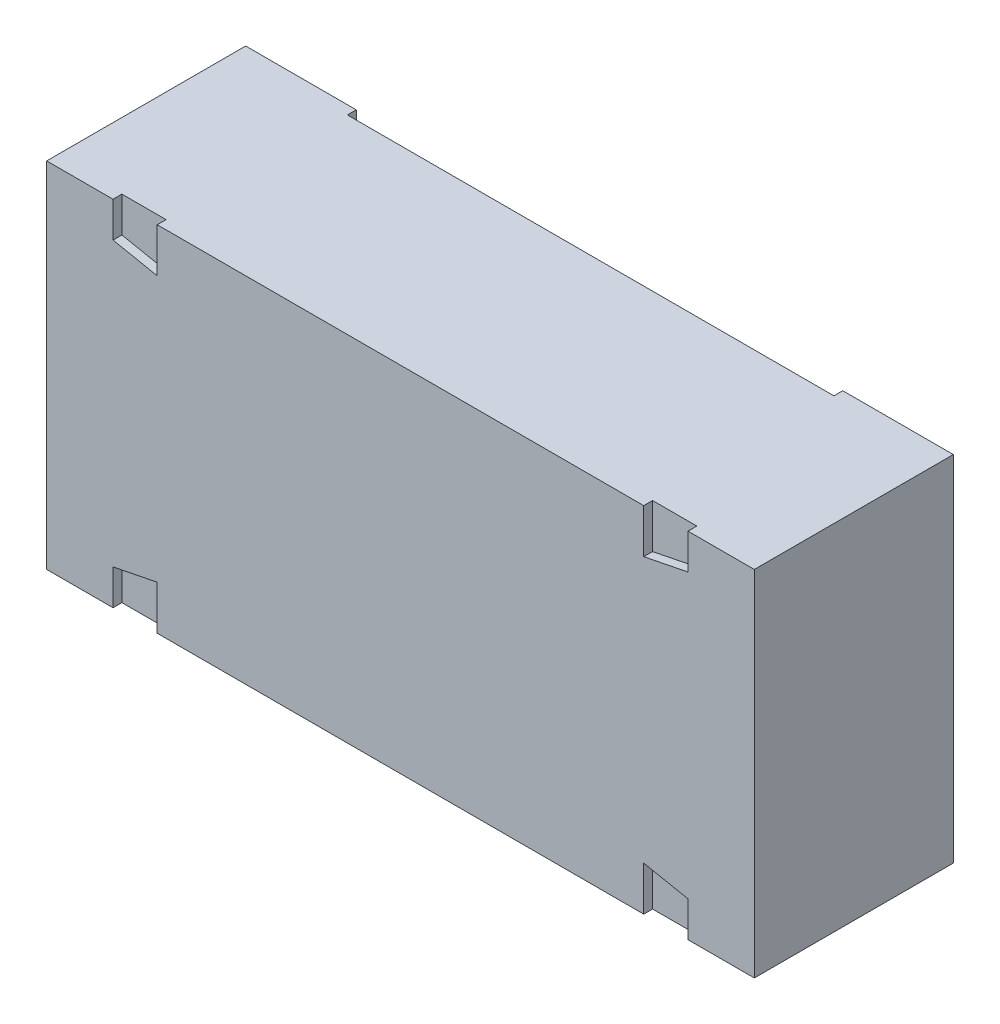
ISO-10303-21;
HEADER;
FILE_DESCRIPTION(('STEP AP214'),'2;1');
FILE_NAME('part.step','',(''),(''),'','','');
FILE_SCHEMA(('AUTOMOTIVE_DESIGN { 1 0 10303 214 1 1 1 1 }'));
ENDSEC;
DATA;
#1=APPLICATION_CONTEXT('core data for automotive mechanical design processes');
#2=APPLICATION_PROTOCOL_DEFINITION('international standard','automotive_design',2000,#1);
#3=PRODUCT_CONTEXT('',#1,'mechanical');
#4=PRODUCT('Part','Part','',(#3));
#5=PRODUCT_RELATED_PRODUCT_CATEGORY('part','',(#4));
#6=PRODUCT_DEFINITION_FORMATION('','',#4);
#7=PRODUCT_DEFINITION_CONTEXT('part definition',#1,'design');
#8=PRODUCT_DEFINITION('design','',#6,#7);
#9=PRODUCT_DEFINITION_SHAPE('','',#8);
#10=(LENGTH_UNIT() NAMED_UNIT(*) SI_UNIT(.MILLI.,.METRE.));
#11=(NAMED_UNIT(*) PLANE_ANGLE_UNIT() SI_UNIT($,.RADIAN.));
#12=(NAMED_UNIT(*) SI_UNIT($,.STERADIAN.) SOLID_ANGLE_UNIT());
#13=UNCERTAINTY_MEASURE_WITH_UNIT(LENGTH_MEASURE(1.E-05),#10,'distance_accuracy_value','');
#14=(GEOMETRIC_REPRESENTATION_CONTEXT(3) GLOBAL_UNCERTAINTY_ASSIGNED_CONTEXT((#13)) GLOBAL_UNIT_ASSIGNED_CONTEXT((#10,
#11,#12)) REPRESENTATION_CONTEXT('',''));
#15=CARTESIAN_POINT('',(0.,0.,0.));
#16=DIRECTION('',(0.,0.,1.));
#17=DIRECTION('',(1.,0.,0.));
#18=AXIS2_PLACEMENT_3D('',#15,#16,#17);
#19=CARTESIAN_POINT('',(0.675,0.,0.));
#20=DIRECTION('',(0.,0.,1.));
#21=DIRECTION('',(1.,0.,0.));
#22=AXIS2_PLACEMENT_3D('',#19,#20,#21);
#23=PLANE('',#22);
#24=DIRECTION('',(1.,0.,0.));
#25=VECTOR('',#24,1.);
#26=CARTESIAN_POINT('',(0.8,0.4,0.));
#27=LINE('',#26,#25);
#28=CARTESIAN_POINT('',(0.55,0.4,0.));
#29=VERTEX_POINT('',#28);
#30=CARTESIAN_POINT('',(0.8,0.4,0.));
#31=VERTEX_POINT('',#30);
#32=EDGE_CURVE('E228',#29,#31,#27,.T.);
#33=ORIENTED_EDGE('',*,*,#32,.T.);
#34=DIRECTION('',(0.,-1.,0.));
#35=VECTOR('',#34,1.);
#36=CARTESIAN_POINT('',(0.8,-0.4,0.));
#37=LINE('',#36,#35);
#38=CARTESIAN_POINT('',(0.8,-0.4,0.));
#39=VERTEX_POINT('',#38);
#40=EDGE_CURVE('E197',#31,#39,#37,.T.);
#41=ORIENTED_EDGE('',*,*,#40,.T.);
#42=DIRECTION('',(-1.,0.,0.));
#43=VECTOR('',#42,1.);
#44=CARTESIAN_POINT('',(0.55,-0.4,0.));
#45=LINE('',#44,#43);
#46=CARTESIAN_POINT('',(0.55,-0.4,0.));
#47=VERTEX_POINT('',#46);
#48=EDGE_CURVE('E173',#39,#47,#45,.T.);
#49=ORIENTED_EDGE('',*,*,#48,.T.);
#50=DIRECTION('',(0.,1.,0.));
#51=VECTOR('',#50,1.);
#52=CARTESIAN_POINT('',(0.55,0.4,0.));
#53=LINE('',#52,#51);
#54=EDGE_CURVE('E17',#47,#29,#53,.T.);
#55=ORIENTED_EDGE('',*,*,#54,.T.);
#56=EDGE_LOOP('',(#33,#41,#49,#55));
#57=FACE_BOUND('',#56,.T.);
#58=ADVANCED_FACE('F14',(#57),#23,.F.);
#59=CARTESIAN_POINT('',(0.55,0.4,0.));
#60=DIRECTION('',(1.,0.,0.));
#61=DIRECTION('',(0.,1.,0.));
#62=AXIS2_PLACEMENT_3D('',#59,#60,#61);
#63=PLANE('',#62);
#64=DIRECTION('',(0.,1.,0.));
#65=VECTOR('',#64,1.);
#66=CARTESIAN_POINT('',(0.55,0.,0.02));
#67=LINE('',#66,#65);
#68=CARTESIAN_POINT('',(0.55,0.4,0.02));
#69=VERTEX_POINT('',#68);
#70=CARTESIAN_POINT('',(0.55,-0.4,0.02));
#71=VERTEX_POINT('',#70);
#72=EDGE_CURVE('E187',#69,#71,#67,.F.);
#73=ORIENTED_EDGE('',*,*,#72,.F.);
#74=DIRECTION('',(0.,0.,1.));
#75=VECTOR('',#74,1.);
#76=CARTESIAN_POINT('',(0.55,0.4,0.));
#77=LINE('',#76,#75);
#78=EDGE_CURVE('E183',#69,#29,#77,.F.);
#79=ORIENTED_EDGE('',*,*,#78,.T.);
#80=ORIENTED_EDGE('',*,*,#54,.F.);
#81=DIRECTION('',(0.,0.,1.));
#82=VECTOR('',#81,1.);
#83=CARTESIAN_POINT('',(0.55,-0.4,0.));
#84=LINE('',#83,#82);
#85=EDGE_CURVE('E181',#47,#71,#84,.T.);
#86=ORIENTED_EDGE('',*,*,#85,.T.);
#87=EDGE_LOOP('',(#73,#79,#80,#86));
#88=FACE_BOUND('',#87,.T.);
#89=ADVANCED_FACE('F180',(#88),#63,.F.);
#90=CARTESIAN_POINT('',(0.,0.,0.02));
#91=DIRECTION('',(0.,0.,-1.));
#92=DIRECTION('',(-1.,0.,0.));
#93=AXIS2_PLACEMENT_3D('',#90,#91,#92);
#94=PLANE('',#93);
#95=ORIENTED_EDGE('',*,*,#72,.T.);
#96=DIRECTION('',(1.,0.,0.));
#97=VECTOR('',#96,1.);
#98=CARTESIAN_POINT('',(0.78,-0.4,0.02));
#99=LINE('',#98,#97);
#100=CARTESIAN_POINT('',(-0.55,-0.4,0.02));
#101=VERTEX_POINT('',#100);
#102=EDGE_CURVE('E192',#101,#71,#99,.T.);
#103=ORIENTED_EDGE('',*,*,#102,.F.);
#104=DIRECTION('',(0.,1.,0.));
#105=VECTOR('',#104,1.);
#106=CARTESIAN_POINT('',(-0.55,-0.4,0.02));
#107=LINE('',#106,#105);
#108=CARTESIAN_POINT('',(-0.55,0.4,0.02));
#109=VERTEX_POINT('',#108);
#110=EDGE_CURVE('E210',#101,#109,#107,.T.);
#111=ORIENTED_EDGE('',*,*,#110,.T.);
#112=DIRECTION('',(1.,0.,0.));
#113=VECTOR('',#112,1.);
#114=CARTESIAN_POINT('',(-0.78,0.4,0.02));
#115=LINE('',#114,#113);
#116=EDGE_CURVE('E204',#69,#109,#115,.F.);
#117=ORIENTED_EDGE('',*,*,#116,.F.);
#118=EDGE_LOOP('',(#95,#103,#111,#117));
#119=FACE_BOUND('',#118,.T.);
#120=ADVANCED_FACE('F221',(#119),#94,.T.);
#121=CARTESIAN_POINT('',(-0.675,0.,0.));
#122=DIRECTION('',(0.,0.,1.));
#123=DIRECTION('',(1.,0.,0.));
#124=AXIS2_PLACEMENT_3D('',#121,#122,#123);
#125=PLANE('',#124);
#126=DIRECTION('',(1.,0.,0.));
#127=VECTOR('',#126,1.);
#128=CARTESIAN_POINT('',(-0.8,-0.4,0.));
#129=LINE('',#128,#127);
#130=CARTESIAN_POINT('',(-0.55,-0.4,0.));
#131=VERTEX_POINT('',#130);
#132=CARTESIAN_POINT('',(-0.8,-0.4,0.));
#133=VERTEX_POINT('',#132);
#134=EDGE_CURVE('E325',#131,#133,#129,.F.);
#135=ORIENTED_EDGE('',*,*,#134,.T.);
#136=DIRECTION('',(0.,1.,0.));
#137=VECTOR('',#136,1.);
#138=CARTESIAN_POINT('',(-0.8,0.4,0.));
#139=LINE('',#138,#137);
#140=CARTESIAN_POINT('',(-0.8,0.4,0.));
#141=VERTEX_POINT('',#140);
#142=EDGE_CURVE('E329',#133,#141,#139,.T.);
#143=ORIENTED_EDGE('',*,*,#142,.T.);
#144=DIRECTION('',(1.,0.,0.));
#145=VECTOR('',#144,1.);
#146=CARTESIAN_POINT('',(-0.55,0.4,0.));
#147=LINE('',#146,#145);
#148=CARTESIAN_POINT('',(-0.55,0.4,0.));
#149=VERTEX_POINT('',#148);
#150=EDGE_CURVE('E344',#141,#149,#147,.T.);
#151=ORIENTED_EDGE('',*,*,#150,.T.);
#152=DIRECTION('',(0.,1.,0.));
#153=VECTOR('',#152,1.);
#154=CARTESIAN_POINT('',(-0.55,-0.4,0.));
#155=LINE('',#154,#153);
#156=EDGE_CURVE('E214',#149,#131,#155,.F.);
#157=ORIENTED_EDGE('',*,*,#156,.T.);
#158=EDGE_LOOP('',(#135,#143,#151,#157));
#159=FACE_BOUND('',#158,.T.);
#160=ADVANCED_FACE('F556',(#159),#125,.F.);
#161=CARTESIAN_POINT('',(-0.55,-0.4,0.));
#162=DIRECTION('',(-1.,0.,0.));
#163=DIRECTION('',(0.,0.,1.));
#164=AXIS2_PLACEMENT_3D('',#161,#162,#163);
#165=PLANE('',#164);
#166=ORIENTED_EDGE('',*,*,#110,.F.);
#167=DIRECTION('',(0.,0.,1.));
#168=VECTOR('',#167,1.);
#169=CARTESIAN_POINT('',(-0.55,-0.4,0.));
#170=LINE('',#169,#168);
#171=EDGE_CURVE('E317',#101,#131,#170,.F.);
#172=ORIENTED_EDGE('',*,*,#171,.T.);
#173=ORIENTED_EDGE('',*,*,#156,.F.);
#174=DIRECTION('',(0.,0.,-1.));
#175=VECTOR('',#174,1.);
#176=CARTESIAN_POINT('',(-0.55,0.4,0.));
#177=LINE('',#176,#175);
#178=EDGE_CURVE('E341',#149,#109,#177,.F.);
#179=ORIENTED_EDGE('',*,*,#178,.T.);
#180=EDGE_LOOP('',(#166,#172,#173,#179));
#181=FACE_BOUND('',#180,.T.);
#182=ADVANCED_FACE('F558',(#181),#165,.F.);
#183=CARTESIAN_POINT('',(0.,0.,0.43));
#184=DIRECTION('',(0.,0.,-1.));
#185=DIRECTION('',(-1.,0.,0.));
#186=AXIS2_PLACEMENT_3D('',#183,#184,#185);
#187=PLANE('',#186);
#188=DIRECTION('',(0.,1.,0.));
#189=VECTOR('',#188,1.);
#190=CARTESIAN_POINT('',(0.65,0.32,0.43));
#191=LINE('',#190,#189);
#192=CARTESIAN_POINT('',(0.650000000000001,0.319999999999995,0.43));
#193=VERTEX_POINT('',#192);
#194=CARTESIAN_POINT('',(0.65,0.4,0.43));
#195=VERTEX_POINT('',#194);
#196=EDGE_CURVE('E230',#193,#195,#191,.T.);
#197=ORIENTED_EDGE('',*,*,#196,.T.);
#198=DIRECTION('',(-1.,0.,0.));
#199=VECTOR('',#198,1.);
#200=CARTESIAN_POINT('',(0.,0.4,0.43));
#201=LINE('',#200,#199);
#202=CARTESIAN_POINT('',(0.55,0.4,0.43));
#203=VERTEX_POINT('',#202);
#204=EDGE_CURVE('E199',#203,#195,#201,.F.);
#205=ORIENTED_EDGE('',*,*,#204,.F.);
#206=DIRECTION('',(0.,1.,0.));
#207=VECTOR('',#206,1.);
#208=CARTESIAN_POINT('',(0.55,0.4,0.43));
#209=LINE('',#208,#207);
#210=CARTESIAN_POINT('',(0.55,0.3,0.43));
#211=VERTEX_POINT('',#210);
#212=EDGE_CURVE('E282',#211,#203,#209,.T.);
#213=ORIENTED_EDGE('',*,*,#212,.F.);
#214=DIRECTION('',(0.980580675690959,0.196116135137992,0.));
#215=VECTOR('',#214,1.);
#216=CARTESIAN_POINT('',(0.55,0.3,0.43));
#217=LINE('',#216,#215);
#218=EDGE_CURVE('E369',#211,#193,#217,.T.);
#219=ORIENTED_EDGE('',*,*,#218,.T.);
#220=EDGE_LOOP('',(#197,#205,#213,#219));
#221=FACE_BOUND('',#220,.T.);
#222=ADVANCED_FACE('F568',(#221),#187,.F.);
#223=CARTESIAN_POINT('',(0.65,-0.4,0.45));
#224=DIRECTION('',(1.,0.,0.));
#225=DIRECTION('',(0.,1.,0.));
#226=AXIS2_PLACEMENT_3D('',#223,#224,#225);
#227=PLANE('',#226);
#228=DIRECTION('',(0.,0.,1.));
#229=VECTOR('',#228,1.);
#230=CARTESIAN_POINT('',(0.65,-0.32,0.45));
#231=LINE('',#230,#229);
#232=CARTESIAN_POINT('',(0.65,-0.32,0.45));
#233=VERTEX_POINT('',#232);
#234=CARTESIAN_POINT('',(0.65,-0.32,0.43));
#235=VERTEX_POINT('',#234);
#236=EDGE_CURVE('E360',#233,#235,#231,.F.);
#237=ORIENTED_EDGE('',*,*,#236,.T.);
#238=DIRECTION('',(0.,1.,0.));
#239=VECTOR('',#238,1.);
#240=CARTESIAN_POINT('',(0.65,0.,0.43));
#241=LINE('',#240,#239);
#242=CARTESIAN_POINT('',(0.65,-0.4,0.43));
#243=VERTEX_POINT('',#242);
#244=EDGE_CURVE('E259',#235,#243,#241,.F.);
#245=ORIENTED_EDGE('',*,*,#244,.T.);
#246=DIRECTION('',(0.,0.,1.));
#247=VECTOR('',#246,1.);
#248=CARTESIAN_POINT('',(0.65,-0.4,0.));
#249=LINE('',#248,#247);
#250=CARTESIAN_POINT('',(0.65,-0.4,0.45));
#251=VERTEX_POINT('',#250);
#252=EDGE_CURVE('E194',#243,#251,#249,.T.);
#253=ORIENTED_EDGE('',*,*,#252,.T.);
#254=DIRECTION('',(0.,1.,0.));
#255=VECTOR('',#254,1.);
#256=CARTESIAN_POINT('',(0.65,0.,0.45));
#257=LINE('',#256,#255);
#258=EDGE_CURVE('E258',#233,#251,#257,.F.);
#259=ORIENTED_EDGE('',*,*,#258,.F.);
#260=EDGE_LOOP('',(#237,#245,#253,#259));
#261=FACE_BOUND('',#260,.T.);
#262=ADVANCED_FACE('F257',(#261),#227,.F.);
#263=CARTESIAN_POINT('',(0.8,-0.4,0.));
#264=DIRECTION('',(-1.,0.,0.));
#265=DIRECTION('',(0.,-1.,0.));
#266=AXIS2_PLACEMENT_3D('',#263,#264,#265);
#267=PLANE('',#266);
#268=DIRECTION('',(0.,0.,1.));
#269=VECTOR('',#268,1.);
#270=CARTESIAN_POINT('',(0.8,0.4,0.));
#271=LINE('',#270,#269);
#272=CARTESIAN_POINT('',(0.8,0.4,0.45));
#273=VERTEX_POINT('',#272);
#274=EDGE_CURVE('E231',#31,#273,#271,.T.);
#275=ORIENTED_EDGE('',*,*,#274,.T.);
#276=DIRECTION('',(0.,1.,0.));
#277=VECTOR('',#276,1.);
#278=CARTESIAN_POINT('',(0.8,0.,0.45));
#279=LINE('',#278,#277);
#280=CARTESIAN_POINT('',(0.8,-0.4,0.45));
#281=VERTEX_POINT('',#280);
#282=EDGE_CURVE('E265',#281,#273,#279,.T.);
#283=ORIENTED_EDGE('',*,*,#282,.F.);
#284=DIRECTION('',(0.,0.,1.));
#285=VECTOR('',#284,1.);
#286=CARTESIAN_POINT('',(0.8,-0.4,0.));
#287=LINE('',#286,#285);
#288=EDGE_CURVE('E247',#39,#281,#287,.T.);
#289=ORIENTED_EDGE('',*,*,#288,.F.);
#290=ORIENTED_EDGE('',*,*,#40,.F.);
#291=EDGE_LOOP('',(#275,#283,#289,#290));
#292=FACE_BOUND('',#291,.T.);
#293=ADVANCED_FACE('F575',(#292),#267,.F.);
#294=CARTESIAN_POINT('',(0.65,0.32,0.45));
#295=DIRECTION('',(1.,0.,0.));
#296=DIRECTION('',(0.,1.,0.));
#297=AXIS2_PLACEMENT_3D('',#294,#295,#296);
#298=PLANE('',#297);
#299=DIRECTION('',(0.,0.,1.));
#300=VECTOR('',#299,1.);
#301=CARTESIAN_POINT('',(0.65,0.4,0.45));
#302=LINE('',#301,#300);
#303=CARTESIAN_POINT('',(0.65,0.4,0.45));
#304=VERTEX_POINT('',#303);
#305=EDGE_CURVE('E237',#195,#304,#302,.T.);
#306=ORIENTED_EDGE('',*,*,#305,.F.);
#307=ORIENTED_EDGE('',*,*,#196,.F.);
#308=DIRECTION('',(0.,0.,1.));
#309=VECTOR('',#308,1.);
#310=CARTESIAN_POINT('',(0.650000000000004,0.31999999999998,0.45));
#311=LINE('',#310,#309);
#312=CARTESIAN_POINT('',(0.650000000000001,0.319999999999995,0.45));
#313=VERTEX_POINT('',#312);
#314=EDGE_CURVE('E365',#193,#313,#311,.T.);
#315=ORIENTED_EDGE('',*,*,#314,.T.);
#316=DIRECTION('',(0.,1.,0.));
#317=VECTOR('',#316,1.);
#318=CARTESIAN_POINT('',(0.65,0.,0.45));
#319=LINE('',#318,#317);
#320=EDGE_CURVE('E379',#304,#313,#319,.F.);
#321=ORIENTED_EDGE('',*,*,#320,.F.);
#322=EDGE_LOOP('',(#306,#307,#315,#321));
#323=FACE_BOUND('',#322,.T.);
#324=ADVANCED_FACE('F380',(#323),#298,.F.);
#325=CARTESIAN_POINT('',(0.55,0.3,0.45));
#326=DIRECTION('',(0.196116135137992,-0.980580675690959,0.));
#327=DIRECTION('',(0.980580675690959,0.196116135137992,0.));
#328=AXIS2_PLACEMENT_3D('',#325,#326,#327);
#329=PLANE('',#328);
#330=ORIENTED_EDGE('',*,*,#314,.F.);
#331=ORIENTED_EDGE('',*,*,#218,.F.);
#332=DIRECTION('',(0.,0.,-1.));
#333=VECTOR('',#332,1.);
#334=CARTESIAN_POINT('',(0.55,0.3,0.43));
#335=LINE('',#334,#333);
#336=CARTESIAN_POINT('',(0.55,0.3,0.45));
#337=VERTEX_POINT('',#336);
#338=EDGE_CURVE('E272',#337,#211,#335,.T.);
#339=ORIENTED_EDGE('',*,*,#338,.F.);
#340=DIRECTION('',(-0.98058067569092,-0.196116135138184,0.));
#341=VECTOR('',#340,1.);
#342=CARTESIAN_POINT('',(0.65,0.32,0.45));
#343=LINE('',#342,#341);
#344=EDGE_CURVE('E384',#313,#337,#343,.T.);
#345=ORIENTED_EDGE('',*,*,#344,.F.);
#346=EDGE_LOOP('',(#330,#331,#339,#345));
#347=FACE_BOUND('',#346,.T.);
#348=ADVANCED_FACE('F488',(#347),#329,.F.);
#349=CARTESIAN_POINT('',(0.,0.,0.43));
#350=DIRECTION('',(0.,0.,-1.));
#351=DIRECTION('',(-1.,0.,0.));
#352=AXIS2_PLACEMENT_3D('',#349,#350,#351);
#353=PLANE('',#352);
#354=ORIENTED_EDGE('',*,*,#244,.F.);
#355=DIRECTION('',(-0.980580675690959,0.196116135137992,0.));
#356=VECTOR('',#355,1.);
#357=CARTESIAN_POINT('',(0.65,-0.32,0.43));
#358=LINE('',#357,#356);
#359=CARTESIAN_POINT('',(0.549999999999999,-0.300000000000005,0.43));
#360=VERTEX_POINT('',#359);
#361=EDGE_CURVE('E356',#235,#360,#358,.T.);
#362=ORIENTED_EDGE('',*,*,#361,.T.);
#363=DIRECTION('',(0.,1.,0.));
#364=VECTOR('',#363,1.);
#365=CARTESIAN_POINT('',(0.55,0.4,0.43));
#366=LINE('',#365,#364);
#367=CARTESIAN_POINT('',(0.55,-0.4,0.43));
#368=VERTEX_POINT('',#367);
#369=EDGE_CURVE('E395',#368,#360,#366,.T.);
#370=ORIENTED_EDGE('',*,*,#369,.F.);
#371=DIRECTION('',(1.,0.,0.));
#372=VECTOR('',#371,1.);
#373=CARTESIAN_POINT('',(0.78,-0.4,0.43));
#374=LINE('',#373,#372);
#375=EDGE_CURVE('E353',#243,#368,#374,.F.);
#376=ORIENTED_EDGE('',*,*,#375,.F.);
#377=EDGE_LOOP('',(#354,#362,#370,#376));
#378=FACE_BOUND('',#377,.T.);
#379=ADVANCED_FACE('F486',(#378),#353,.F.);
#380=CARTESIAN_POINT('',(0.65,-0.32,0.45));
#381=DIRECTION('',(0.196116135137992,0.980580675690959,0.));
#382=DIRECTION('',(-0.980580675690959,0.196116135137992,0.));
#383=AXIS2_PLACEMENT_3D('',#380,#381,#382);
#384=PLANE('',#383);
#385=DIRECTION('',(0.,0.,-1.));
#386=VECTOR('',#385,1.);
#387=CARTESIAN_POINT('',(0.55,-0.3,0.43));
#388=LINE('',#387,#386);
#389=CARTESIAN_POINT('',(0.549999999999998,-0.30000000000001,0.45));
#390=VERTEX_POINT('',#389);
#391=EDGE_CURVE('E398',#360,#390,#388,.F.);
#392=ORIENTED_EDGE('',*,*,#391,.F.);
#393=ORIENTED_EDGE('',*,*,#361,.F.);
#394=ORIENTED_EDGE('',*,*,#236,.F.);
#395=DIRECTION('',(0.98058067569092,-0.196116135138184,0.));
#396=VECTOR('',#395,1.);
#397=CARTESIAN_POINT('',(0.55,-0.3,0.45));
#398=LINE('',#397,#396);
#399=EDGE_CURVE('E389',#390,#233,#398,.T.);
#400=ORIENTED_EDGE('',*,*,#399,.F.);
#401=EDGE_LOOP('',(#392,#393,#394,#400));
#402=FACE_BOUND('',#401,.T.);
#403=ADVANCED_FACE('F483',(#402),#384,.F.);
#404=CARTESIAN_POINT('',(0.,0.,0.43));
#405=DIRECTION('',(0.,0.,-1.));
#406=DIRECTION('',(-1.,0.,0.));
#407=AXIS2_PLACEMENT_3D('',#404,#405,#406);
#408=PLANE('',#407);
#409=DIRECTION('',(-0.980580675690959,-0.196116135137992,0.));
#410=VECTOR('',#409,1.);
#411=CARTESIAN_POINT('',(-0.55,-0.3,0.43));
#412=LINE('',#411,#410);
#413=CARTESIAN_POINT('',(-0.55,-0.3,0.43));
#414=VERTEX_POINT('',#413);
#415=CARTESIAN_POINT('',(-0.650000000000001,-0.319999999999995,0.43));
#416=VERTEX_POINT('',#415);
#417=EDGE_CURVE('E305',#414,#416,#412,.T.);
#418=ORIENTED_EDGE('',*,*,#417,.T.);
#419=DIRECTION('',(0.,1.,0.));
#420=VECTOR('',#419,1.);
#421=CARTESIAN_POINT('',(-0.65,-0.32,0.43));
#422=LINE('',#421,#420);
#423=CARTESIAN_POINT('',(-0.65,-0.4,0.43));
#424=VERTEX_POINT('',#423);
#425=EDGE_CURVE('E313',#416,#424,#422,.F.);
#426=ORIENTED_EDGE('',*,*,#425,.T.);
#427=DIRECTION('',(-1.,0.,0.));
#428=VECTOR('',#427,1.);
#429=CARTESIAN_POINT('',(0.,-0.4,0.43));
#430=LINE('',#429,#428);
#431=CARTESIAN_POINT('',(-0.55,-0.4,0.43));
#432=VERTEX_POINT('',#431);
#433=EDGE_CURVE('E348',#432,#424,#430,.T.);
#434=ORIENTED_EDGE('',*,*,#433,.F.);
#435=DIRECTION('',(0.,1.,0.));
#436=VECTOR('',#435,1.);
#437=CARTESIAN_POINT('',(-0.55,-0.4,0.43));
#438=LINE('',#437,#436);
#439=EDGE_CURVE('E404',#414,#432,#438,.F.);
#440=ORIENTED_EDGE('',*,*,#439,.F.);
#441=EDGE_LOOP('',(#418,#426,#434,#440));
#442=FACE_BOUND('',#441,.T.);
#443=ADVANCED_FACE('F495',(#442),#408,.F.);
#444=CARTESIAN_POINT('',(-0.65,0.4,0.45));
#445=DIRECTION('',(-1.,0.,0.));
#446=DIRECTION('',(0.,0.,1.));
#447=AXIS2_PLACEMENT_3D('',#444,#445,#446);
#448=PLANE('',#447);
#449=DIRECTION('',(0.,0.,1.));
#450=VECTOR('',#449,1.);
#451=CARTESIAN_POINT('',(-0.65,0.32,0.45));
#452=LINE('',#451,#450);
#453=CARTESIAN_POINT('',(-0.65,0.32,0.45));
#454=VERTEX_POINT('',#453);
#455=CARTESIAN_POINT('',(-0.65,0.32,0.43));
#456=VERTEX_POINT('',#455);
#457=EDGE_CURVE('E290',#454,#456,#452,.F.);
#458=ORIENTED_EDGE('',*,*,#457,.T.);
#459=DIRECTION('',(0.,1.,0.));
#460=VECTOR('',#459,1.);
#461=CARTESIAN_POINT('',(-0.65,0.,0.43));
#462=LINE('',#461,#460);
#463=CARTESIAN_POINT('',(-0.65,0.4,0.43));
#464=VERTEX_POINT('',#463);
#465=EDGE_CURVE('E297',#456,#464,#462,.T.);
#466=ORIENTED_EDGE('',*,*,#465,.T.);
#467=DIRECTION('',(0.,0.,-1.));
#468=VECTOR('',#467,1.);
#469=CARTESIAN_POINT('',(-0.65,0.4,0.));
#470=LINE('',#469,#468);
#471=CARTESIAN_POINT('',(-0.65,0.4,0.45));
#472=VERTEX_POINT('',#471);
#473=EDGE_CURVE('E337',#464,#472,#470,.F.);
#474=ORIENTED_EDGE('',*,*,#473,.T.);
#475=DIRECTION('',(0.,1.,0.));
#476=VECTOR('',#475,1.);
#477=CARTESIAN_POINT('',(-0.65,0.,0.45));
#478=LINE('',#477,#476);
#479=EDGE_CURVE('E415',#454,#472,#478,.T.);
#480=ORIENTED_EDGE('',*,*,#479,.F.);
#481=EDGE_LOOP('',(#458,#466,#474,#480));
#482=FACE_BOUND('',#481,.T.);
#483=ADVANCED_FACE('F538',(#482),#448,.F.);
#484=CARTESIAN_POINT('',(-0.8,0.4,0.));
#485=DIRECTION('',(1.,0.,0.));
#486=DIRECTION('',(0.,0.,-1.));
#487=AXIS2_PLACEMENT_3D('',#484,#485,#486);
#488=PLANE('',#487);
#489=DIRECTION('',(0.,0.,1.));
#490=VECTOR('',#489,1.);
#491=CARTESIAN_POINT('',(-0.8,-0.4,0.));
#492=LINE('',#491,#490);
#493=CARTESIAN_POINT('',(-0.8,-0.4,0.45));
#494=VERTEX_POINT('',#493);
#495=EDGE_CURVE('E321',#133,#494,#492,.T.);
#496=ORIENTED_EDGE('',*,*,#495,.T.);
#497=DIRECTION('',(0.,1.,0.));
#498=VECTOR('',#497,1.);
#499=CARTESIAN_POINT('',(-0.8,0.,0.45));
#500=LINE('',#499,#498);
#501=CARTESIAN_POINT('',(-0.8,0.4,0.45));
#502=VERTEX_POINT('',#501);
#503=EDGE_CURVE('E421',#502,#494,#500,.F.);
#504=ORIENTED_EDGE('',*,*,#503,.F.);
#505=DIRECTION('',(0.,0.,-1.));
#506=VECTOR('',#505,1.);
#507=CARTESIAN_POINT('',(-0.8,0.4,0.));
#508=LINE('',#507,#506);
#509=EDGE_CURVE('E333',#141,#502,#508,.F.);
#510=ORIENTED_EDGE('',*,*,#509,.F.);
#511=ORIENTED_EDGE('',*,*,#142,.F.);
#512=EDGE_LOOP('',(#496,#504,#510,#511));
#513=FACE_BOUND('',#512,.T.);
#514=ADVANCED_FACE('F534',(#513),#488,.F.);
#515=CARTESIAN_POINT('',(-0.65,-0.32,0.45));
#516=DIRECTION('',(-1.,0.,0.));
#517=DIRECTION('',(0.,0.,1.));
#518=AXIS2_PLACEMENT_3D('',#515,#516,#517);
#519=PLANE('',#518);
#520=DIRECTION('',(0.,0.,1.));
#521=VECTOR('',#520,1.);
#522=CARTESIAN_POINT('',(-0.65,-0.4,0.45));
#523=LINE('',#522,#521);
#524=CARTESIAN_POINT('',(-0.65,-0.4,0.45));
#525=VERTEX_POINT('',#524);
#526=EDGE_CURVE('E309',#424,#525,#523,.T.);
#527=ORIENTED_EDGE('',*,*,#526,.F.);
#528=ORIENTED_EDGE('',*,*,#425,.F.);
#529=DIRECTION('',(0.,0.,1.));
#530=VECTOR('',#529,1.);
#531=CARTESIAN_POINT('',(-0.650000000000004,-0.31999999999998,0.45));
#532=LINE('',#531,#530);
#533=CARTESIAN_POINT('',(-0.650000000000001,-0.319999999999995,0.45));
#534=VERTEX_POINT('',#533);
#535=EDGE_CURVE('E301',#416,#534,#532,.T.);
#536=ORIENTED_EDGE('',*,*,#535,.T.);
#537=DIRECTION('',(0.,1.,0.));
#538=VECTOR('',#537,1.);
#539=CARTESIAN_POINT('',(-0.65,0.,0.45));
#540=LINE('',#539,#538);
#541=EDGE_CURVE('E427',#525,#534,#540,.T.);
#542=ORIENTED_EDGE('',*,*,#541,.F.);
#543=EDGE_LOOP('',(#527,#528,#536,#542));
#544=FACE_BOUND('',#543,.T.);
#545=ADVANCED_FACE('F530',(#544),#519,.F.);
#546=CARTESIAN_POINT('',(-0.55,-0.3,0.45));
#547=DIRECTION('',(-0.196116135137992,0.980580675690959,0.));
#548=DIRECTION('',(-0.980580675690959,-0.196116135137992,0.));
#549=AXIS2_PLACEMENT_3D('',#546,#547,#548);
#550=PLANE('',#549);
#551=ORIENTED_EDGE('',*,*,#535,.F.);
#552=ORIENTED_EDGE('',*,*,#417,.F.);
#553=DIRECTION('',(0.,0.,1.));
#554=VECTOR('',#553,1.);
#555=CARTESIAN_POINT('',(-0.55,-0.3,0.43));
#556=LINE('',#555,#554);
#557=CARTESIAN_POINT('',(-0.55,-0.3,0.45));
#558=VERTEX_POINT('',#557);
#559=EDGE_CURVE('E411',#558,#414,#556,.F.);
#560=ORIENTED_EDGE('',*,*,#559,.F.);
#561=DIRECTION('',(0.98058067569092,0.196116135138184,0.));
#562=VECTOR('',#561,1.);
#563=CARTESIAN_POINT('',(-0.65,-0.32,0.45));
#564=LINE('',#563,#562);
#565=EDGE_CURVE('E430',#534,#558,#564,.T.);
#566=ORIENTED_EDGE('',*,*,#565,.F.);
#567=EDGE_LOOP('',(#551,#552,#560,#566));
#568=FACE_BOUND('',#567,.T.);
#569=ADVANCED_FACE('F526',(#568),#550,.F.);
#570=CARTESIAN_POINT('',(0.,0.,0.43));
#571=DIRECTION('',(0.,0.,-1.));
#572=DIRECTION('',(-1.,0.,0.));
#573=AXIS2_PLACEMENT_3D('',#570,#571,#572);
#574=PLANE('',#573);
#575=DIRECTION('',(0.,1.,0.));
#576=VECTOR('',#575,1.);
#577=CARTESIAN_POINT('',(-0.55,-0.4,0.43));
#578=LINE('',#577,#576);
#579=CARTESIAN_POINT('',(-0.55,0.4,0.43));
#580=VERTEX_POINT('',#579);
#581=CARTESIAN_POINT('',(-0.549999999999999,0.300000000000005,0.43));
#582=VERTEX_POINT('',#581);
#583=EDGE_CURVE('E437',#580,#582,#578,.F.);
#584=ORIENTED_EDGE('',*,*,#583,.F.);
#585=DIRECTION('',(-1.,0.,0.));
#586=VECTOR('',#585,1.);
#587=CARTESIAN_POINT('',(0.,0.4,0.43));
#588=LINE('',#587,#586);
#589=EDGE_CURVE('E294',#464,#580,#588,.F.);
#590=ORIENTED_EDGE('',*,*,#589,.F.);
#591=ORIENTED_EDGE('',*,*,#465,.F.);
#592=DIRECTION('',(0.980580675690959,-0.196116135137992,0.));
#593=VECTOR('',#592,1.);
#594=CARTESIAN_POINT('',(-0.65,0.32,0.43));
#595=LINE('',#594,#593);
#596=EDGE_CURVE('E286',#456,#582,#595,.T.);
#597=ORIENTED_EDGE('',*,*,#596,.T.);
#598=EDGE_LOOP('',(#584,#590,#591,#597));
#599=FACE_BOUND('',#598,.T.);
#600=ADVANCED_FACE('F522',(#599),#574,.F.);
#601=CARTESIAN_POINT('',(-0.65,0.32,0.45));
#602=DIRECTION('',(-0.196116135137992,-0.980580675690959,0.));
#603=DIRECTION('',(0.980580675690959,-0.196116135137992,0.));
#604=AXIS2_PLACEMENT_3D('',#601,#602,#603);
#605=PLANE('',#604);
#606=DIRECTION('',(0.,0.,1.));
#607=VECTOR('',#606,1.);
#608=CARTESIAN_POINT('',(-0.55,0.3,0.43));
#609=LINE('',#608,#607);
#610=CARTESIAN_POINT('',(-0.549999999999998,0.30000000000001,0.45));
#611=VERTEX_POINT('',#610);
#612=EDGE_CURVE('E32',#582,#611,#609,.T.);
#613=ORIENTED_EDGE('',*,*,#612,.F.);
#614=ORIENTED_EDGE('',*,*,#596,.F.);
#615=ORIENTED_EDGE('',*,*,#457,.F.);
#616=DIRECTION('',(-0.98058067569092,0.196116135138184,0.));
#617=VECTOR('',#616,1.);
#618=CARTESIAN_POINT('',(-0.55,0.3,0.45));
#619=LINE('',#618,#617);
#620=EDGE_CURVE('E433',#611,#454,#619,.T.);
#621=ORIENTED_EDGE('',*,*,#620,.F.);
#622=EDGE_LOOP('',(#613,#614,#615,#621));
#623=FACE_BOUND('',#622,.T.);
#624=ADVANCED_FACE('F519',(#623),#605,.F.);
#625=CARTESIAN_POINT('',(-0.55,0.4,0.43));
#626=DIRECTION('',(0.,1.,0.));
#627=DIRECTION('',(0.,0.,1.));
#628=AXIS2_PLACEMENT_3D('',#625,#626,#627);
#629=PLANE('',#628);
#630=DIRECTION('',(0.,0.,-1.));
#631=VECTOR('',#630,1.);
#632=CARTESIAN_POINT('',(0.55,0.4,0.43));
#633=LINE('',#632,#631);
#634=CARTESIAN_POINT('',(0.55,0.4,0.45));
#635=VERTEX_POINT('',#634);
#636=EDGE_CURVE('E279',#203,#635,#633,.F.);
#637=ORIENTED_EDGE('',*,*,#636,.F.);
#638=ORIENTED_EDGE('',*,*,#204,.T.);
#639=ORIENTED_EDGE('',*,*,#305,.T.);
#640=DIRECTION('',(1.,0.,0.));
#641=VECTOR('',#640,1.);
#642=CARTESIAN_POINT('',(0.675,0.4,0.45));
#643=LINE('',#642,#641);
#644=EDGE_CURVE('E270',#273,#304,#643,.F.);
#645=ORIENTED_EDGE('',*,*,#644,.F.);
#646=ORIENTED_EDGE('',*,*,#274,.F.);
#647=ORIENTED_EDGE('',*,*,#32,.F.);
#648=ORIENTED_EDGE('',*,*,#78,.F.);
#649=ORIENTED_EDGE('',*,*,#116,.T.);
#650=ORIENTED_EDGE('',*,*,#178,.F.);
#651=ORIENTED_EDGE('',*,*,#150,.F.);
#652=ORIENTED_EDGE('',*,*,#509,.T.);
#653=DIRECTION('',(1.,0.,0.));
#654=VECTOR('',#653,1.);
#655=CARTESIAN_POINT('',(-0.675,0.4,0.45));
#656=LINE('',#655,#654);
#657=EDGE_CURVE('E418',#472,#502,#656,.F.);
#658=ORIENTED_EDGE('',*,*,#657,.F.);
#659=ORIENTED_EDGE('',*,*,#473,.F.);
#660=ORIENTED_EDGE('',*,*,#589,.T.);
#661=DIRECTION('',(0.,0.,1.));
#662=VECTOR('',#661,1.);
#663=CARTESIAN_POINT('',(-0.55,0.4,0.43));
#664=LINE('',#663,#662);
#665=CARTESIAN_POINT('',(-0.55,0.4,0.45));
#666=VERTEX_POINT('',#665);
#667=EDGE_CURVE('E442',#666,#580,#664,.F.);
#668=ORIENTED_EDGE('',*,*,#667,.F.);
#669=DIRECTION('',(1.,0.,0.));
#670=VECTOR('',#669,1.);
#671=CARTESIAN_POINT('',(0.,0.4,0.45));
#672=LINE('',#671,#670);
#673=EDGE_CURVE('E446',#666,#635,#672,.T.);
#674=ORIENTED_EDGE('',*,*,#673,.T.);
#675=EDGE_LOOP('',(#637,#638,#639,#645,#646,#647,#648,#649,#650,#651,#652,#658,#659,#660,#668,#674));
#676=FACE_BOUND('',#675,.T.);
#677=ADVANCED_FACE('F226',(#676),#629,.T.);
#678=CARTESIAN_POINT('',(0.55,0.4,0.43));
#679=DIRECTION('',(1.,0.,0.));
#680=DIRECTION('',(0.,0.,-1.));
#681=AXIS2_PLACEMENT_3D('',#678,#679,#680);
#682=PLANE('',#681);
#683=DIRECTION('',(0.,1.,0.));
#684=VECTOR('',#683,1.);
#685=CARTESIAN_POINT('',(0.55,0.,0.45));
#686=LINE('',#685,#684);
#687=EDGE_CURVE('E450',#635,#337,#686,.F.);
#688=ORIENTED_EDGE('',*,*,#687,.T.);
#689=ORIENTED_EDGE('',*,*,#338,.T.);
#690=ORIENTED_EDGE('',*,*,#212,.T.);
#691=ORIENTED_EDGE('',*,*,#636,.T.);
#692=EDGE_LOOP('',(#688,#689,#690,#691));
#693=FACE_BOUND('',#692,.T.);
#694=ADVANCED_FACE('F513',(#693),#682,.T.);
#695=CARTESIAN_POINT('',(0.55,0.4,0.43));
#696=DIRECTION('',(1.,0.,0.));
#697=DIRECTION('',(0.,0.,-1.));
#698=AXIS2_PLACEMENT_3D('',#695,#696,#697);
#699=PLANE('',#698);
#700=DIRECTION('',(0.,1.,0.));
#701=VECTOR('',#700,1.);
#702=CARTESIAN_POINT('',(0.55,0.,0.45));
#703=LINE('',#702,#701);
#704=CARTESIAN_POINT('',(0.55,-0.4,0.45));
#705=VERTEX_POINT('',#704);
#706=EDGE_CURVE('E454',#390,#705,#703,.F.);
#707=ORIENTED_EDGE('',*,*,#706,.T.);
#708=DIRECTION('',(0.,0.,-1.));
#709=VECTOR('',#708,1.);
#710=CARTESIAN_POINT('',(0.55,-0.4,0.43));
#711=LINE('',#710,#709);
#712=EDGE_CURVE('E401',#368,#705,#711,.F.);
#713=ORIENTED_EDGE('',*,*,#712,.F.);
#714=ORIENTED_EDGE('',*,*,#369,.T.);
#715=ORIENTED_EDGE('',*,*,#391,.T.);
#716=EDGE_LOOP('',(#707,#713,#714,#715));
#717=FACE_BOUND('',#716,.T.);
#718=ADVANCED_FACE('F479',(#717),#699,.T.);
#719=CARTESIAN_POINT('',(0.55,-0.4,0.43));
#720=DIRECTION('',(0.,-1.,0.));
#721=DIRECTION('',(0.,0.,-1.));
#722=AXIS2_PLACEMENT_3D('',#719,#720,#721);
#723=PLANE('',#722);
#724=ORIENTED_EDGE('',*,*,#252,.F.);
#725=ORIENTED_EDGE('',*,*,#375,.T.);
#726=ORIENTED_EDGE('',*,*,#712,.T.);
#727=DIRECTION('',(1.,0.,0.));
#728=VECTOR('',#727,1.);
#729=CARTESIAN_POINT('',(0.,-0.4,0.45));
#730=LINE('',#729,#728);
#731=CARTESIAN_POINT('',(-0.55,-0.4,0.45));
#732=VERTEX_POINT('',#731);
#733=EDGE_CURVE('E458',#705,#732,#730,.F.);
#734=ORIENTED_EDGE('',*,*,#733,.T.);
#735=DIRECTION('',(0.,0.,1.));
#736=VECTOR('',#735,1.);
#737=CARTESIAN_POINT('',(-0.55,-0.4,0.43));
#738=LINE('',#737,#736);
#739=EDGE_CURVE('E408',#432,#732,#738,.T.);
#740=ORIENTED_EDGE('',*,*,#739,.F.);
#741=ORIENTED_EDGE('',*,*,#433,.T.);
#742=ORIENTED_EDGE('',*,*,#526,.T.);
#743=DIRECTION('',(1.,0.,0.));
#744=VECTOR('',#743,1.);
#745=CARTESIAN_POINT('',(-0.675,-0.4,0.45));
#746=LINE('',#745,#744);
#747=EDGE_CURVE('E424',#494,#525,#746,.T.);
#748=ORIENTED_EDGE('',*,*,#747,.F.);
#749=ORIENTED_EDGE('',*,*,#495,.F.);
#750=ORIENTED_EDGE('',*,*,#134,.F.);
#751=ORIENTED_EDGE('',*,*,#171,.F.);
#752=ORIENTED_EDGE('',*,*,#102,.T.);
#753=ORIENTED_EDGE('',*,*,#85,.F.);
#754=ORIENTED_EDGE('',*,*,#48,.F.);
#755=ORIENTED_EDGE('',*,*,#288,.T.);
#756=DIRECTION('',(1.,0.,0.));
#757=VECTOR('',#756,1.);
#758=CARTESIAN_POINT('',(0.675,-0.4,0.45));
#759=LINE('',#758,#757);
#760=EDGE_CURVE('E261',#251,#281,#759,.T.);
#761=ORIENTED_EDGE('',*,*,#760,.F.);
#762=EDGE_LOOP('',(#724,#725,#726,#734,#740,#741,#742,#748,#749,#750,#751,#752,#753,#754,#755,#761));
#763=FACE_BOUND('',#762,.T.);
#764=ADVANCED_FACE('F189',(#763),#723,.T.);
#765=CARTESIAN_POINT('',(-0.55,-0.4,0.43));
#766=DIRECTION('',(-1.,0.,0.));
#767=DIRECTION('',(0.,0.,1.));
#768=AXIS2_PLACEMENT_3D('',#765,#766,#767);
#769=PLANE('',#768);
#770=DIRECTION('',(0.,1.,0.));
#771=VECTOR('',#770,1.);
#772=CARTESIAN_POINT('',(-0.55,0.,0.45));
#773=LINE('',#772,#771);
#774=EDGE_CURVE('E24',#732,#558,#773,.T.);
#775=ORIENTED_EDGE('',*,*,#774,.T.);
#776=ORIENTED_EDGE('',*,*,#559,.T.);
#777=ORIENTED_EDGE('',*,*,#439,.T.);
#778=ORIENTED_EDGE('',*,*,#739,.T.);
#779=EDGE_LOOP('',(#775,#776,#777,#778));
#780=FACE_BOUND('',#779,.T.);
#781=ADVANCED_FACE('F467',(#780),#769,.T.);
#782=CARTESIAN_POINT('',(-0.55,-0.4,0.43));
#783=DIRECTION('',(-1.,0.,0.));
#784=DIRECTION('',(0.,0.,1.));
#785=AXIS2_PLACEMENT_3D('',#782,#783,#784);
#786=PLANE('',#785);
#787=DIRECTION('',(0.,1.,0.));
#788=VECTOR('',#787,1.);
#789=CARTESIAN_POINT('',(-0.55,0.,0.45));
#790=LINE('',#789,#788);
#791=EDGE_CURVE('E9',#611,#666,#790,.T.);
#792=ORIENTED_EDGE('',*,*,#791,.T.);
#793=ORIENTED_EDGE('',*,*,#667,.T.);
#794=ORIENTED_EDGE('',*,*,#583,.T.);
#795=ORIENTED_EDGE('',*,*,#612,.T.);
#796=EDGE_LOOP('',(#792,#793,#794,#795));
#797=FACE_BOUND('',#796,.T.);
#798=ADVANCED_FACE('F500',(#797),#786,.T.);
#799=CARTESIAN_POINT('',(0.,0.,0.45));
#800=DIRECTION('',(0.,0.,-1.));
#801=DIRECTION('',(0.,1.,0.));
#802=AXIS2_PLACEMENT_3D('',#799,#800,#801);
#803=PLANE('',#802);
#804=ORIENTED_EDGE('',*,*,#791,.F.);
#805=ORIENTED_EDGE('',*,*,#620,.T.);
#806=ORIENTED_EDGE('',*,*,#479,.T.);
#807=ORIENTED_EDGE('',*,*,#657,.T.);
#808=ORIENTED_EDGE('',*,*,#503,.T.);
#809=ORIENTED_EDGE('',*,*,#747,.T.);
#810=ORIENTED_EDGE('',*,*,#541,.T.);
#811=ORIENTED_EDGE('',*,*,#565,.T.);
#812=ORIENTED_EDGE('',*,*,#774,.F.);
#813=ORIENTED_EDGE('',*,*,#733,.F.);
#814=ORIENTED_EDGE('',*,*,#706,.F.);
#815=ORIENTED_EDGE('',*,*,#399,.T.);
#816=ORIENTED_EDGE('',*,*,#258,.T.);
#817=ORIENTED_EDGE('',*,*,#760,.T.);
#818=ORIENTED_EDGE('',*,*,#282,.T.);
#819=ORIENTED_EDGE('',*,*,#644,.T.);
#820=ORIENTED_EDGE('',*,*,#320,.T.);
#821=ORIENTED_EDGE('',*,*,#344,.T.);
#822=ORIENTED_EDGE('',*,*,#687,.F.);
#823=ORIENTED_EDGE('',*,*,#673,.F.);
#824=EDGE_LOOP('',(#804,#805,#806,#807,#808,#809,#810,#811,#812,#813,#814,#815,#816,#817,#818,
#819,#820,#821,#822,#823));
#825=FACE_BOUND('',#824,.T.);
#826=ADVANCED_FACE('F473',(#825),#803,.F.);
#827=CLOSED_SHELL('',(#58,#89,#120,#160,#182,#222,#262,#293,#324,#348,#379,#403,#443,#483,#514,
#545,#569,#600,#624,#677,#694,#718,#764,#781,#798,#826));
#828=MANIFOLD_SOLID_BREP('B1',#827);
#829=ADVANCED_BREP_SHAPE_REPRESENTATION('',(#18,#828),#14);
#830=SHAPE_DEFINITION_REPRESENTATION(#9,#829);
ENDSEC;
END-ISO-10303-21;
